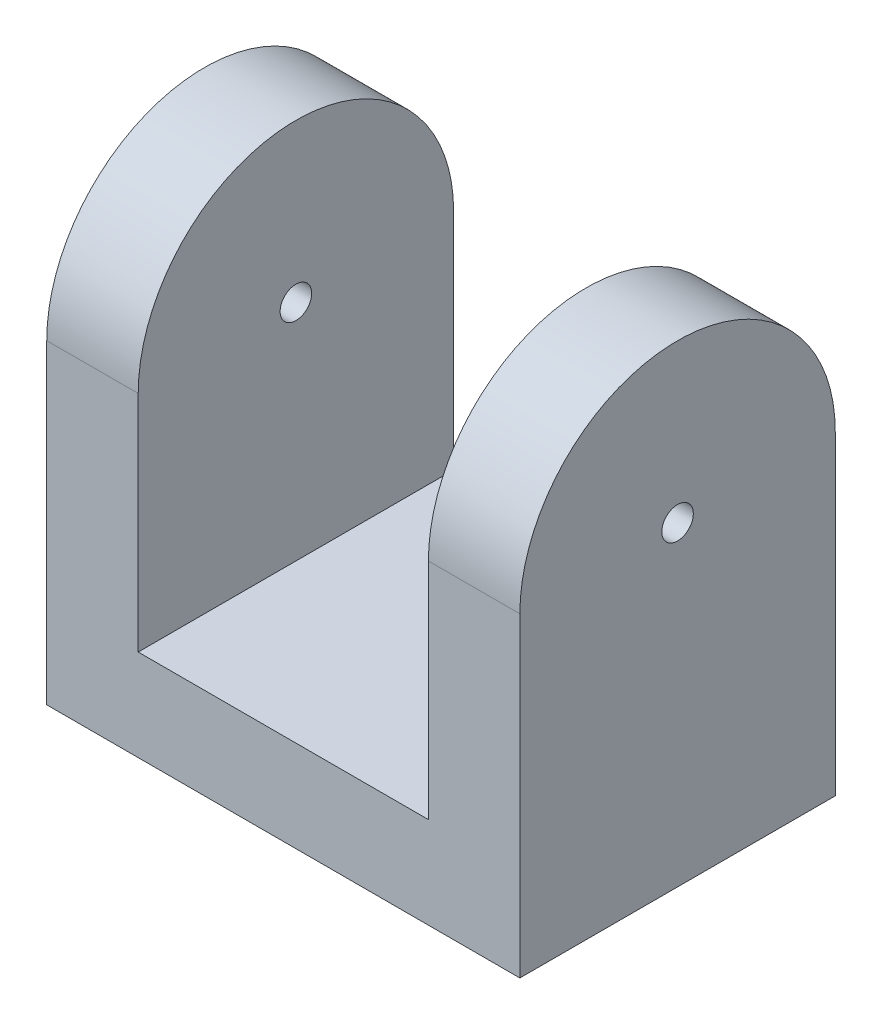
ISO-10303-21;
HEADER;
FILE_DESCRIPTION(('STEP AP214'),'2;1');
FILE_NAME('part.step','',(''),(''),'','','');
FILE_SCHEMA(('AUTOMOTIVE_DESIGN { 1 0 10303 214 1 1 1 1 }'));
ENDSEC;
DATA;
#1=APPLICATION_CONTEXT('core data for automotive mechanical design processes');
#2=APPLICATION_PROTOCOL_DEFINITION('international standard','automotive_design',2000,#1);
#3=PRODUCT_CONTEXT('',#1,'mechanical');
#4=PRODUCT('Part','Part','',(#3));
#5=PRODUCT_RELATED_PRODUCT_CATEGORY('part','',(#4));
#6=PRODUCT_DEFINITION_FORMATION('','',#4);
#7=PRODUCT_DEFINITION_CONTEXT('part definition',#1,'design');
#8=PRODUCT_DEFINITION('design','',#6,#7);
#9=PRODUCT_DEFINITION_SHAPE('','',#8);
#10=(LENGTH_UNIT() NAMED_UNIT(*) SI_UNIT(.MILLI.,.METRE.));
#11=(NAMED_UNIT(*) PLANE_ANGLE_UNIT() SI_UNIT($,.RADIAN.));
#12=(NAMED_UNIT(*) SI_UNIT($,.STERADIAN.) SOLID_ANGLE_UNIT());
#13=UNCERTAINTY_MEASURE_WITH_UNIT(LENGTH_MEASURE(1.E-05),#10,'distance_accuracy_value','');
#14=(GEOMETRIC_REPRESENTATION_CONTEXT(3) GLOBAL_UNCERTAINTY_ASSIGNED_CONTEXT((#13)) GLOBAL_UNIT_ASSIGNED_CONTEXT((#10,
#11,#12)) REPRESENTATION_CONTEXT('',''));
#15=CARTESIAN_POINT('',(0.,0.,0.));
#16=DIRECTION('',(0.,0.,1.));
#17=DIRECTION('',(1.,0.,0.));
#18=AXIS2_PLACEMENT_3D('',#15,#16,#17);
#19=CARTESIAN_POINT('',(150.,0.,0.));
#20=DIRECTION('',(-1.,0.,0.));
#21=DIRECTION('',(0.,0.,1.));
#22=AXIS2_PLACEMENT_3D('',#19,#20,#21);
#23=CYLINDRICAL_SURFACE('',#22,50.);
#24=CARTESIAN_POINT('',(121.,0.,0.));
#25=DIRECTION('',(-1.,0.,0.));
#26=DIRECTION('',(0.,-1.,0.));
#27=AXIS2_PLACEMENT_3D('',#24,#25,#26);
#28=CIRCLE('',#27,50.);
#29=CARTESIAN_POINT('',(121.,0.,50.));
#30=VERTEX_POINT('',#29);
#31=CARTESIAN_POINT('',(121.,0.,-50.));
#32=VERTEX_POINT('',#31);
#33=EDGE_CURVE('E120',#30,#32,#28,.T.);
#34=ORIENTED_EDGE('',*,*,#33,.F.);
#35=DIRECTION('',(-1.,0.,0.));
#36=VECTOR('',#35,1.);
#37=CARTESIAN_POINT('',(150.,0.,50.));
#38=LINE('',#37,#36);
#39=CARTESIAN_POINT('',(150.,0.,50.));
#40=VERTEX_POINT('',#39);
#41=EDGE_CURVE('E178',#40,#30,#38,.T.);
#42=ORIENTED_EDGE('',*,*,#41,.F.);
#43=CARTESIAN_POINT('',(150.,0.,0.));
#44=DIRECTION('',(1.,0.,0.));
#45=DIRECTION('',(0.,0.,-1.));
#46=AXIS2_PLACEMENT_3D('',#43,#44,#45);
#47=CIRCLE('',#46,50.);
#48=CARTESIAN_POINT('',(150.,0.,-50.));
#49=VERTEX_POINT('',#48);
#50=EDGE_CURVE('E153',#49,#40,#47,.T.);
#51=ORIENTED_EDGE('',*,*,#50,.F.);
#52=DIRECTION('',(-1.,0.,0.));
#53=VECTOR('',#52,1.);
#54=CARTESIAN_POINT('',(150.,0.,-50.));
#55=LINE('',#54,#53);
#56=EDGE_CURVE('E169',#49,#32,#55,.T.);
#57=ORIENTED_EDGE('',*,*,#56,.T.);
#58=EDGE_LOOP('',(#34,#42,#51,#57));
#59=FACE_BOUND('',#58,.T.);
#60=ADVANCED_FACE('F41',(#59),#23,.T.);
#61=CARTESIAN_POINT('',(29.,0.,50.));
#62=VERTEX_POINT('',#61);
#63=CARTESIAN_POINT('',(0.,0.,50.));
#64=VERTEX_POINT('',#63);
#65=EDGE_CURVE('E177',#62,#64,#38,.T.);
#66=ORIENTED_EDGE('',*,*,#65,.F.);
#67=CARTESIAN_POINT('',(29.,0.,0.));
#68=DIRECTION('',(-1.,0.,0.));
#69=DIRECTION('',(0.,-1.,0.));
#70=AXIS2_PLACEMENT_3D('',#67,#68,#69);
#71=CIRCLE('',#70,50.);
#72=CARTESIAN_POINT('',(29.,0.,-50.));
#73=VERTEX_POINT('',#72);
#74=EDGE_CURVE('E143',#62,#73,#71,.T.);
#75=ORIENTED_EDGE('',*,*,#74,.T.);
#76=CARTESIAN_POINT('',(0.,0.,-50.));
#77=VERTEX_POINT('',#76);
#78=EDGE_CURVE('E87',#73,#77,#55,.T.);
#79=ORIENTED_EDGE('',*,*,#78,.T.);
#80=CARTESIAN_POINT('',(0.,0.,0.));
#81=DIRECTION('',(1.,0.,0.));
#82=DIRECTION('',(0.,0.,-1.));
#83=AXIS2_PLACEMENT_3D('',#80,#81,#82);
#84=CIRCLE('',#83,50.);
#85=EDGE_CURVE('E162',#77,#64,#84,.T.);
#86=ORIENTED_EDGE('',*,*,#85,.T.);
#87=EDGE_LOOP('',(#66,#75,#79,#86));
#88=FACE_BOUND('',#87,.T.);
#89=ADVANCED_FACE('F189',(#88),#23,.T.);
#90=CARTESIAN_POINT('',(150.,0.,50.));
#91=DIRECTION('',(0.,0.,-1.));
#92=DIRECTION('',(0.,1.,0.));
#93=AXIS2_PLACEMENT_3D('',#90,#91,#92);
#94=PLANE('',#93);
#95=DIRECTION('',(0.,-1.,0.));
#96=VECTOR('',#95,1.);
#97=CARTESIAN_POINT('',(121.,0.,50.));
#98=LINE('',#97,#96);
#99=CARTESIAN_POINT('',(121.,-71.,50.));
#100=VERTEX_POINT('',#99);
#101=EDGE_CURVE('E138',#30,#100,#98,.T.);
#102=ORIENTED_EDGE('',*,*,#101,.T.);
#103=DIRECTION('',(1.,0.,0.));
#104=VECTOR('',#103,1.);
#105=CARTESIAN_POINT('',(0.,-71.,50.));
#106=LINE('',#105,#104);
#107=CARTESIAN_POINT('',(29.,-71.,50.));
#108=VERTEX_POINT('',#107);
#109=EDGE_CURVE('E125',#108,#100,#106,.T.);
#110=ORIENTED_EDGE('',*,*,#109,.F.);
#111=DIRECTION('',(0.,-1.,0.));
#112=VECTOR('',#111,1.);
#113=CARTESIAN_POINT('',(29.,0.,50.));
#114=LINE('',#113,#112);
#115=EDGE_CURVE('E135',#62,#108,#114,.T.);
#116=ORIENTED_EDGE('',*,*,#115,.F.);
#117=ORIENTED_EDGE('',*,*,#65,.T.);
#118=DIRECTION('',(0.,-1.,0.));
#119=VECTOR('',#118,1.);
#120=CARTESIAN_POINT('',(0.,0.,50.));
#121=LINE('',#120,#119);
#122=CARTESIAN_POINT('',(0.,-100.,50.));
#123=VERTEX_POINT('',#122);
#124=EDGE_CURVE('E164',#64,#123,#121,.T.);
#125=ORIENTED_EDGE('',*,*,#124,.T.);
#126=DIRECTION('',(-1.,0.,0.));
#127=VECTOR('',#126,1.);
#128=CARTESIAN_POINT('',(150.,-100.,50.));
#129=LINE('',#128,#127);
#130=CARTESIAN_POINT('',(150.,-100.,50.));
#131=VERTEX_POINT('',#130);
#132=EDGE_CURVE('E174',#131,#123,#129,.T.);
#133=ORIENTED_EDGE('',*,*,#132,.F.);
#134=DIRECTION('',(0.,-1.,0.));
#135=VECTOR('',#134,1.);
#136=CARTESIAN_POINT('',(150.,0.,50.));
#137=LINE('',#136,#135);
#138=EDGE_CURVE('E95',#40,#131,#137,.T.);
#139=ORIENTED_EDGE('',*,*,#138,.F.);
#140=ORIENTED_EDGE('',*,*,#41,.T.);
#141=EDGE_LOOP('',(#102,#110,#116,#117,#125,#133,#139,#140));
#142=FACE_BOUND('',#141,.T.);
#143=ADVANCED_FACE('F183',(#142),#94,.F.);
#144=CARTESIAN_POINT('',(150.,0.,0.));
#145=DIRECTION('',(-1.,0.,0.));
#146=DIRECTION('',(0.,0.,1.));
#147=AXIS2_PLACEMENT_3D('',#144,#145,#146);
#148=CYLINDRICAL_SURFACE('',#147,5.);
#149=CARTESIAN_POINT('',(150.,0.,0.));
#150=DIRECTION('',(1.,0.,0.));
#151=DIRECTION('',(0.,0.,-1.));
#152=AXIS2_PLACEMENT_3D('',#149,#150,#151);
#153=CIRCLE('',#152,5.);
#154=CARTESIAN_POINT('',(150.,0.,-5.));
#155=VERTEX_POINT('',#154);
#156=EDGE_CURVE('E150',#155,#155,#153,.T.);
#157=ORIENTED_EDGE('',*,*,#156,.T.);
#158=EDGE_LOOP('',(#157));
#159=FACE_BOUND('',#158,.T.);
#160=CARTESIAN_POINT('',(121.,0.,0.));
#161=DIRECTION('',(-1.,0.,0.));
#162=DIRECTION('',(0.,-1.,0.));
#163=AXIS2_PLACEMENT_3D('',#160,#161,#162);
#164=CIRCLE('',#163,5.);
#165=CARTESIAN_POINT('',(121.,-5.,0.));
#166=VERTEX_POINT('',#165);
#167=EDGE_CURVE('E145',#166,#166,#164,.T.);
#168=ORIENTED_EDGE('',*,*,#167,.T.);
#169=EDGE_LOOP('',(#168));
#170=FACE_BOUND('',#169,.T.);
#171=ADVANCED_FACE('F195',(#159,#170),#148,.F.);
#172=CARTESIAN_POINT('',(150.,0.,-50.));
#173=DIRECTION('',(0.,0.,1.));
#174=DIRECTION('',(0.,-1.,0.));
#175=AXIS2_PLACEMENT_3D('',#172,#173,#174);
#176=PLANE('',#175);
#177=DIRECTION('',(0.,-1.,0.));
#178=VECTOR('',#177,1.);
#179=CARTESIAN_POINT('',(121.,0.,-50.));
#180=LINE('',#179,#178);
#181=CARTESIAN_POINT('',(121.,-71.,-50.));
#182=VERTEX_POINT('',#181);
#183=EDGE_CURVE('E11',#32,#182,#180,.T.);
#184=ORIENTED_EDGE('',*,*,#183,.F.);
#185=ORIENTED_EDGE('',*,*,#56,.F.);
#186=DIRECTION('',(0.,1.,0.));
#187=VECTOR('',#186,1.);
#188=CARTESIAN_POINT('',(150.,0.,-50.));
#189=LINE('',#188,#187);
#190=CARTESIAN_POINT('',(150.,-100.,-50.));
#191=VERTEX_POINT('',#190);
#192=EDGE_CURVE('E65',#191,#49,#189,.T.);
#193=ORIENTED_EDGE('',*,*,#192,.F.);
#194=DIRECTION('',(-1.,0.,0.));
#195=VECTOR('',#194,1.);
#196=CARTESIAN_POINT('',(150.,-100.,-50.));
#197=LINE('',#196,#195);
#198=CARTESIAN_POINT('',(0.,-100.,-50.));
#199=VERTEX_POINT('',#198);
#200=EDGE_CURVE('E171',#191,#199,#197,.T.);
#201=ORIENTED_EDGE('',*,*,#200,.T.);
#202=DIRECTION('',(0.,1.,0.));
#203=VECTOR('',#202,1.);
#204=CARTESIAN_POINT('',(0.,0.,-50.));
#205=LINE('',#204,#203);
#206=EDGE_CURVE('E154',#199,#77,#205,.T.);
#207=ORIENTED_EDGE('',*,*,#206,.T.);
#208=ORIENTED_EDGE('',*,*,#78,.F.);
#209=DIRECTION('',(0.,-1.,0.));
#210=VECTOR('',#209,1.);
#211=CARTESIAN_POINT('',(29.,0.,-50.));
#212=LINE('',#211,#210);
#213=CARTESIAN_POINT('',(29.,-71.,-50.));
#214=VERTEX_POINT('',#213);
#215=EDGE_CURVE('E49',#73,#214,#212,.T.);
#216=ORIENTED_EDGE('',*,*,#215,.T.);
#217=DIRECTION('',(1.,0.,0.));
#218=VECTOR('',#217,1.);
#219=CARTESIAN_POINT('',(0.,-71.,-50.));
#220=LINE('',#219,#218);
#221=EDGE_CURVE('E56',#214,#182,#220,.T.);
#222=ORIENTED_EDGE('',*,*,#221,.T.);
#223=EDGE_LOOP('',(#184,#185,#193,#201,#207,#208,#216,#222));
#224=FACE_BOUND('',#223,.T.);
#225=ADVANCED_FACE('F131',(#224),#176,.F.);
#226=CARTESIAN_POINT('',(150.,-100.,0.));
#227=DIRECTION('',(0.,1.,0.));
#228=DIRECTION('',(0.,0.,1.));
#229=AXIS2_PLACEMENT_3D('',#226,#227,#228);
#230=PLANE('',#229);
#231=DIRECTION('',(0.,0.,-1.));
#232=VECTOR('',#231,1.);
#233=CARTESIAN_POINT('',(0.,-100.,0.));
#234=LINE('',#233,#232);
#235=EDGE_CURVE('E166',#123,#199,#234,.T.);
#236=ORIENTED_EDGE('',*,*,#235,.T.);
#237=ORIENTED_EDGE('',*,*,#200,.F.);
#238=DIRECTION('',(0.,0.,-1.));
#239=VECTOR('',#238,1.);
#240=CARTESIAN_POINT('',(150.,-100.,0.));
#241=LINE('',#240,#239);
#242=EDGE_CURVE('E157',#131,#191,#241,.T.);
#243=ORIENTED_EDGE('',*,*,#242,.F.);
#244=ORIENTED_EDGE('',*,*,#132,.T.);
#245=EDGE_LOOP('',(#236,#237,#243,#244));
#246=FACE_BOUND('',#245,.T.);
#247=ADVANCED_FACE('F199',(#246),#230,.F.);
#248=CARTESIAN_POINT('',(29.,0.,0.));
#249=DIRECTION('',(-1.,0.,0.));
#250=DIRECTION('',(0.,-1.,0.));
#251=AXIS2_PLACEMENT_3D('',#248,#249,#250);
#252=CIRCLE('',#251,5.);
#253=CARTESIAN_POINT('',(29.,-5.,0.));
#254=VERTEX_POINT('',#253);
#255=EDGE_CURVE('E127',#254,#254,#252,.T.);
#256=ORIENTED_EDGE('',*,*,#255,.F.);
#257=EDGE_LOOP('',(#256));
#258=FACE_BOUND('',#257,.T.);
#259=CARTESIAN_POINT('',(0.,0.,0.));
#260=DIRECTION('',(1.,0.,0.));
#261=DIRECTION('',(0.,0.,-1.));
#262=AXIS2_PLACEMENT_3D('',#259,#260,#261);
#263=CIRCLE('',#262,5.);
#264=CARTESIAN_POINT('',(0.,0.,-5.));
#265=VERTEX_POINT('',#264);
#266=EDGE_CURVE('E149',#265,#265,#263,.T.);
#267=ORIENTED_EDGE('',*,*,#266,.F.);
#268=EDGE_LOOP('',(#267));
#269=FACE_BOUND('',#268,.T.);
#270=ADVANCED_FACE('F43',(#258,#269),#148,.F.);
#271=CARTESIAN_POINT('',(150.,0.,0.));
#272=DIRECTION('',(1.,0.,0.));
#273=DIRECTION('',(0.,0.,-1.));
#274=AXIS2_PLACEMENT_3D('',#271,#272,#273);
#275=PLANE('',#274);
#276=ORIENTED_EDGE('',*,*,#156,.F.);
#277=EDGE_LOOP('',(#276));
#278=FACE_BOUND('',#277,.T.);
#279=ORIENTED_EDGE('',*,*,#50,.T.);
#280=ORIENTED_EDGE('',*,*,#138,.T.);
#281=ORIENTED_EDGE('',*,*,#242,.T.);
#282=ORIENTED_EDGE('',*,*,#192,.T.);
#283=EDGE_LOOP('',(#279,#280,#281,#282));
#284=FACE_BOUND('',#283,.T.);
#285=ADVANCED_FACE('F207',(#278,#284),#275,.T.);
#286=CARTESIAN_POINT('',(0.,0.,0.));
#287=DIRECTION('',(1.,0.,0.));
#288=DIRECTION('',(0.,0.,-1.));
#289=AXIS2_PLACEMENT_3D('',#286,#287,#288);
#290=PLANE('',#289);
#291=ORIENTED_EDGE('',*,*,#266,.T.);
#292=EDGE_LOOP('',(#291));
#293=FACE_BOUND('',#292,.T.);
#294=ORIENTED_EDGE('',*,*,#85,.F.);
#295=ORIENTED_EDGE('',*,*,#206,.F.);
#296=ORIENTED_EDGE('',*,*,#235,.F.);
#297=ORIENTED_EDGE('',*,*,#124,.F.);
#298=EDGE_LOOP('',(#294,#295,#296,#297));
#299=FACE_BOUND('',#298,.T.);
#300=ADVANCED_FACE('F187',(#293,#299),#290,.F.);
#301=CARTESIAN_POINT('',(121.,0.,-50.));
#302=DIRECTION('',(-1.,0.,0.));
#303=DIRECTION('',(0.,-1.,0.));
#304=AXIS2_PLACEMENT_3D('',#301,#302,#303);
#305=PLANE('',#304);
#306=ORIENTED_EDGE('',*,*,#167,.F.);
#307=EDGE_LOOP('',(#306));
#308=FACE_BOUND('',#307,.T.);
#309=ORIENTED_EDGE('',*,*,#33,.T.);
#310=ORIENTED_EDGE('',*,*,#183,.T.);
#311=DIRECTION('',(0.,0.,1.));
#312=VECTOR('',#311,1.);
#313=CARTESIAN_POINT('',(121.,-71.,-50.));
#314=LINE('',#313,#312);
#315=EDGE_CURVE('E117',#182,#100,#314,.T.);
#316=ORIENTED_EDGE('',*,*,#315,.T.);
#317=ORIENTED_EDGE('',*,*,#101,.F.);
#318=EDGE_LOOP('',(#309,#310,#316,#317));
#319=FACE_BOUND('',#318,.T.);
#320=ADVANCED_FACE('F116',(#308,#319),#305,.T.);
#321=CARTESIAN_POINT('',(29.,0.,-50.));
#322=DIRECTION('',(-1.,0.,0.));
#323=DIRECTION('',(0.,-1.,0.));
#324=AXIS2_PLACEMENT_3D('',#321,#322,#323);
#325=PLANE('',#324);
#326=ORIENTED_EDGE('',*,*,#255,.T.);
#327=EDGE_LOOP('',(#326));
#328=FACE_BOUND('',#327,.T.);
#329=ORIENTED_EDGE('',*,*,#115,.T.);
#330=DIRECTION('',(0.,0.,1.));
#331=VECTOR('',#330,1.);
#332=CARTESIAN_POINT('',(29.,-71.,-50.));
#333=LINE('',#332,#331);
#334=EDGE_CURVE('E128',#214,#108,#333,.T.);
#335=ORIENTED_EDGE('',*,*,#334,.F.);
#336=ORIENTED_EDGE('',*,*,#215,.F.);
#337=ORIENTED_EDGE('',*,*,#74,.F.);
#338=EDGE_LOOP('',(#329,#335,#336,#337));
#339=FACE_BOUND('',#338,.T.);
#340=ADVANCED_FACE('F214',(#328,#339),#325,.F.);
#341=CARTESIAN_POINT('',(0.,-71.,-50.));
#342=DIRECTION('',(0.,-1.,0.));
#343=DIRECTION('',(0.,0.,-1.));
#344=AXIS2_PLACEMENT_3D('',#341,#342,#343);
#345=PLANE('',#344);
#346=ORIENTED_EDGE('',*,*,#109,.T.);
#347=ORIENTED_EDGE('',*,*,#315,.F.);
#348=ORIENTED_EDGE('',*,*,#221,.F.);
#349=ORIENTED_EDGE('',*,*,#334,.T.);
#350=EDGE_LOOP('',(#346,#347,#348,#349));
#351=FACE_BOUND('',#350,.T.);
#352=ADVANCED_FACE('F123',(#351),#345,.F.);
#353=CLOSED_SHELL('',(#60,#89,#143,#171,#225,#247,#270,#285,#300,#320,#340,#352));
#354=MANIFOLD_SOLID_BREP('B2',#353);
#355=ADVANCED_BREP_SHAPE_REPRESENTATION('',(#18,#354),#14);
#356=SHAPE_DEFINITION_REPRESENTATION(#9,#355);
ENDSEC;
END-ISO-10303-21;
